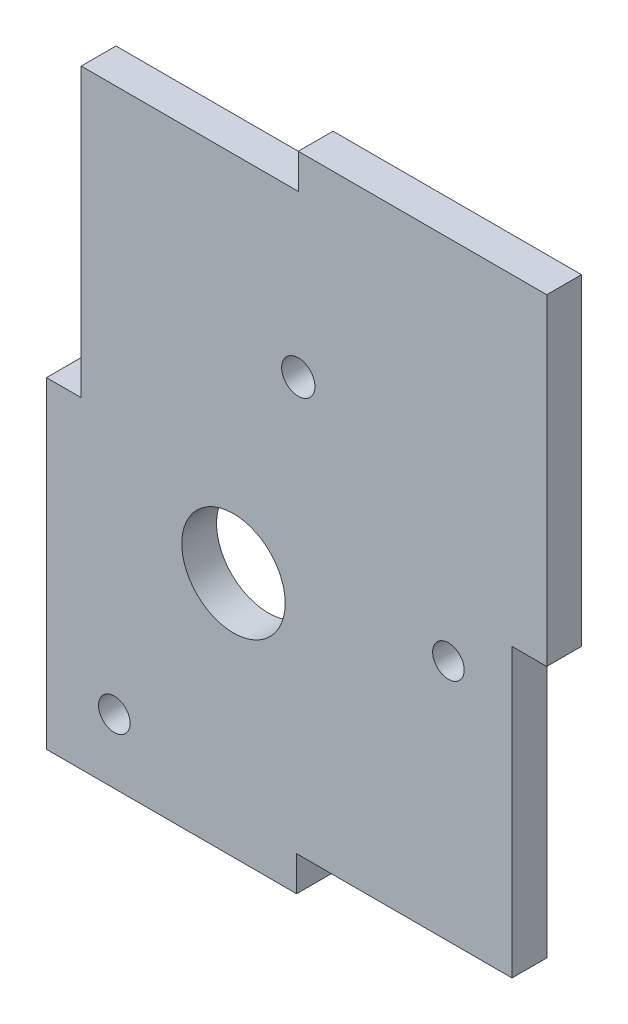
ISO-10303-21;
HEADER;
FILE_DESCRIPTION(('STEP AP214'),'2;1');
FILE_NAME('part.step','',(''),(''),'','','');
FILE_SCHEMA(('AUTOMOTIVE_DESIGN { 1 0 10303 214 1 1 1 1 }'));
ENDSEC;
DATA;
#1=APPLICATION_CONTEXT('core data for automotive mechanical design processes');
#2=APPLICATION_PROTOCOL_DEFINITION('international standard','automotive_design',2000,#1);
#3=PRODUCT_CONTEXT('',#1,'mechanical');
#4=PRODUCT('Part','Part','',(#3));
#5=PRODUCT_RELATED_PRODUCT_CATEGORY('part','',(#4));
#6=PRODUCT_DEFINITION_FORMATION('','',#4);
#7=PRODUCT_DEFINITION_CONTEXT('part definition',#1,'design');
#8=PRODUCT_DEFINITION('design','',#6,#7);
#9=PRODUCT_DEFINITION_SHAPE('','',#8);
#10=(LENGTH_UNIT() NAMED_UNIT(*) SI_UNIT(.MILLI.,.METRE.));
#11=(NAMED_UNIT(*) PLANE_ANGLE_UNIT() SI_UNIT($,.RADIAN.));
#12=(NAMED_UNIT(*) SI_UNIT($,.STERADIAN.) SOLID_ANGLE_UNIT());
#13=UNCERTAINTY_MEASURE_WITH_UNIT(LENGTH_MEASURE(1.E-05),#10,'distance_accuracy_value','');
#14=(GEOMETRIC_REPRESENTATION_CONTEXT(3) GLOBAL_UNCERTAINTY_ASSIGNED_CONTEXT((#13)) GLOBAL_UNIT_ASSIGNED_CONTEXT((#10,
#11,#12)) REPRESENTATION_CONTEXT('',''));
#15=CARTESIAN_POINT('',(0.,0.,0.));
#16=DIRECTION('',(0.,0.,1.));
#17=DIRECTION('',(1.,0.,0.));
#18=AXIS2_PLACEMENT_3D('',#15,#16,#17);
#19=CARTESIAN_POINT('',(19.05,0.,3.0734));
#20=DIRECTION('',(-1.,0.,0.));
#21=DIRECTION('',(0.,-1.,0.));
#22=AXIS2_PLACEMENT_3D('',#19,#20,#21);
#23=PLANE('',#22);
#24=DIRECTION('',(0.,1.,0.));
#25=VECTOR('',#24,1.);
#26=CARTESIAN_POINT('',(19.05,0.,0.));
#27=LINE('',#26,#25);
#28=CARTESIAN_POINT('',(19.05,-3.0734,0.));
#29=VERTEX_POINT('',#28);
#30=CARTESIAN_POINT('',(19.05,0.,0.));
#31=VERTEX_POINT('',#30);
#32=EDGE_CURVE('E167',#29,#31,#27,.T.);
#33=ORIENTED_EDGE('',*,*,#32,.T.);
#34=DIRECTION('',(0.,0.,-1.));
#35=VECTOR('',#34,1.);
#36=CARTESIAN_POINT('',(19.05,0.,3.0734));
#37=LINE('',#36,#35);
#38=CARTESIAN_POINT('',(19.05,0.,3.0734));
#39=VERTEX_POINT('',#38);
#40=EDGE_CURVE('E11',#39,#31,#37,.T.);
#41=ORIENTED_EDGE('',*,*,#40,.F.);
#42=DIRECTION('',(0.,1.,0.));
#43=VECTOR('',#42,1.);
#44=CARTESIAN_POINT('',(19.05,0.,3.0734));
#45=LINE('',#44,#43);
#46=CARTESIAN_POINT('',(19.05,-3.0734,3.0734));
#47=VERTEX_POINT('',#46);
#48=EDGE_CURVE('E208',#47,#39,#45,.T.);
#49=ORIENTED_EDGE('',*,*,#48,.F.);
#50=DIRECTION('',(0.,0.,-1.));
#51=VECTOR('',#50,1.);
#52=CARTESIAN_POINT('',(19.05,-3.0734,3.0734));
#53=LINE('',#52,#51);
#54=EDGE_CURVE('E166',#47,#29,#53,.T.);
#55=ORIENTED_EDGE('',*,*,#54,.T.);
#56=EDGE_LOOP('',(#33,#41,#49,#55));
#57=FACE_BOUND('',#56,.T.);
#58=ADVANCED_FACE('F34',(#57),#23,.F.);
#59=CARTESIAN_POINT('',(0.,0.,3.0734));
#60=DIRECTION('',(0.,1.,0.));
#61=DIRECTION('',(0.,0.,1.));
#62=AXIS2_PLACEMENT_3D('',#59,#60,#61);
#63=PLANE('',#62);
#64=DIRECTION('',(1.,0.,0.));
#65=VECTOR('',#64,1.);
#66=CARTESIAN_POINT('',(0.,0.,0.));
#67=LINE('',#66,#65);
#68=CARTESIAN_POINT('',(38.1,0.,0.));
#69=VERTEX_POINT('',#68);
#70=EDGE_CURVE('E170',#31,#69,#67,.T.);
#71=ORIENTED_EDGE('',*,*,#70,.T.);
#72=DIRECTION('',(0.,0.,-1.));
#73=VECTOR('',#72,1.);
#74=CARTESIAN_POINT('',(38.1,0.,3.0734));
#75=LINE('',#74,#73);
#76=CARTESIAN_POINT('',(38.1,0.,3.0734));
#77=VERTEX_POINT('',#76);
#78=EDGE_CURVE('E42',#77,#69,#75,.T.);
#79=ORIENTED_EDGE('',*,*,#78,.F.);
#80=DIRECTION('',(1.,0.,0.));
#81=VECTOR('',#80,1.);
#82=CARTESIAN_POINT('',(0.,0.,3.0734));
#83=LINE('',#82,#81);
#84=EDGE_CURVE('E105',#39,#77,#83,.T.);
#85=ORIENTED_EDGE('',*,*,#84,.F.);
#86=ORIENTED_EDGE('',*,*,#40,.T.);
#87=EDGE_LOOP('',(#71,#79,#85,#86));
#88=FACE_BOUND('',#87,.T.);
#89=ADVANCED_FACE('F280',(#88),#63,.F.);
#90=CARTESIAN_POINT('',(38.1,0.,3.0734));
#91=DIRECTION('',(-1.,0.,0.));
#92=DIRECTION('',(0.,0.,1.));
#93=AXIS2_PLACEMENT_3D('',#90,#91,#92);
#94=PLANE('',#93);
#95=DIRECTION('',(0.,1.,0.));
#96=VECTOR('',#95,1.);
#97=CARTESIAN_POINT('',(38.1,0.,0.));
#98=LINE('',#97,#96);
#99=CARTESIAN_POINT('',(38.1,25.4,0.));
#100=VERTEX_POINT('',#99);
#101=EDGE_CURVE('E172',#69,#100,#98,.T.);
#102=ORIENTED_EDGE('',*,*,#101,.T.);
#103=DIRECTION('',(0.,0.,-1.));
#104=VECTOR('',#103,1.);
#105=CARTESIAN_POINT('',(38.1,25.4,3.0734));
#106=LINE('',#105,#104);
#107=CARTESIAN_POINT('',(38.1,25.4,3.0734));
#108=VERTEX_POINT('',#107);
#109=EDGE_CURVE('E222',#108,#100,#106,.T.);
#110=ORIENTED_EDGE('',*,*,#109,.F.);
#111=DIRECTION('',(0.,1.,0.));
#112=VECTOR('',#111,1.);
#113=CARTESIAN_POINT('',(38.1,0.,3.0734));
#114=LINE('',#113,#112);
#115=EDGE_CURVE('E229',#77,#108,#114,.T.);
#116=ORIENTED_EDGE('',*,*,#115,.F.);
#117=ORIENTED_EDGE('',*,*,#78,.T.);
#118=EDGE_LOOP('',(#102,#110,#116,#117));
#119=FACE_BOUND('',#118,.T.);
#120=ADVANCED_FACE('F227',(#119),#94,.F.);
#121=CARTESIAN_POINT('',(0.,25.4,3.0734));
#122=DIRECTION('',(0.,-1.,0.));
#123=DIRECTION('',(0.,0.,-1.));
#124=AXIS2_PLACEMENT_3D('',#121,#122,#123);
#125=PLANE('',#124);
#126=DIRECTION('',(-1.,0.,0.));
#127=VECTOR('',#126,1.);
#128=CARTESIAN_POINT('',(0.,25.4,0.));
#129=LINE('',#128,#127);
#130=CARTESIAN_POINT('',(41.1734,25.4,0.));
#131=VERTEX_POINT('',#130);
#132=EDGE_CURVE('E175',#131,#100,#129,.T.);
#133=ORIENTED_EDGE('',*,*,#132,.F.);
#134=DIRECTION('',(0.,0.,-1.));
#135=VECTOR('',#134,1.);
#136=CARTESIAN_POINT('',(41.1734,25.4,3.0734));
#137=LINE('',#136,#135);
#138=CARTESIAN_POINT('',(41.1734,25.4,3.0734));
#139=VERTEX_POINT('',#138);
#140=EDGE_CURVE('E220',#139,#131,#137,.T.);
#141=ORIENTED_EDGE('',*,*,#140,.F.);
#142=DIRECTION('',(-1.,0.,0.));
#143=VECTOR('',#142,1.);
#144=CARTESIAN_POINT('',(0.,25.4,3.0734));
#145=LINE('',#144,#143);
#146=EDGE_CURVE('E240',#139,#108,#145,.T.);
#147=ORIENTED_EDGE('',*,*,#146,.T.);
#148=ORIENTED_EDGE('',*,*,#109,.T.);
#149=EDGE_LOOP('',(#133,#141,#147,#148));
#150=FACE_BOUND('',#149,.T.);
#151=ADVANCED_FACE('F237',(#150),#125,.T.);
#152=CARTESIAN_POINT('',(41.1734,0.,3.0734));
#153=DIRECTION('',(1.,0.,0.));
#154=DIRECTION('',(0.,1.,0.));
#155=AXIS2_PLACEMENT_3D('',#152,#153,#154);
#156=PLANE('',#155);
#157=DIRECTION('',(0.,-1.,0.));
#158=VECTOR('',#157,1.);
#159=CARTESIAN_POINT('',(41.1734,0.,0.));
#160=LINE('',#159,#158);
#161=CARTESIAN_POINT('',(41.1734,53.8734,0.));
#162=VERTEX_POINT('',#161);
#163=EDGE_CURVE('E178',#162,#131,#160,.T.);
#164=ORIENTED_EDGE('',*,*,#163,.F.);
#165=DIRECTION('',(0.,0.,-1.));
#166=VECTOR('',#165,1.);
#167=CARTESIAN_POINT('',(41.1734,53.8734,3.0734));
#168=LINE('',#167,#166);
#169=CARTESIAN_POINT('',(41.1734,53.8734,3.0734));
#170=VERTEX_POINT('',#169);
#171=EDGE_CURVE('E218',#170,#162,#168,.T.);
#172=ORIENTED_EDGE('',*,*,#171,.F.);
#173=DIRECTION('',(0.,-1.,0.));
#174=VECTOR('',#173,1.);
#175=CARTESIAN_POINT('',(41.1734,0.,3.0734));
#176=LINE('',#175,#174);
#177=EDGE_CURVE('E243',#170,#139,#176,.T.);
#178=ORIENTED_EDGE('',*,*,#177,.T.);
#179=ORIENTED_EDGE('',*,*,#140,.T.);
#180=EDGE_LOOP('',(#164,#172,#178,#179));
#181=FACE_BOUND('',#180,.T.);
#182=ADVANCED_FACE('F291',(#181),#156,.T.);
#183=CARTESIAN_POINT('',(0.,53.8734,3.0734));
#184=DIRECTION('',(0.,1.,0.));
#185=DIRECTION('',(0.,0.,1.));
#186=AXIS2_PLACEMENT_3D('',#183,#184,#185);
#187=PLANE('',#186);
#188=DIRECTION('',(1.,0.,0.));
#189=VECTOR('',#188,1.);
#190=CARTESIAN_POINT('',(0.,53.8734,0.));
#191=LINE('',#190,#189);
#192=CARTESIAN_POINT('',(19.1967167483988,53.8734,0.));
#193=VERTEX_POINT('',#192);
#194=EDGE_CURVE('E181',#193,#162,#191,.T.);
#195=ORIENTED_EDGE('',*,*,#194,.F.);
#196=DIRECTION('',(0.,0.,-1.));
#197=VECTOR('',#196,1.);
#198=CARTESIAN_POINT('',(19.1967167483988,53.8734,3.0734));
#199=LINE('',#198,#197);
#200=CARTESIAN_POINT('',(19.1967167483988,53.8734,3.0734));
#201=VERTEX_POINT('',#200);
#202=EDGE_CURVE('E216',#201,#193,#199,.T.);
#203=ORIENTED_EDGE('',*,*,#202,.F.);
#204=DIRECTION('',(1.,0.,0.));
#205=VECTOR('',#204,1.);
#206=CARTESIAN_POINT('',(0.,53.8734,3.0734));
#207=LINE('',#206,#205);
#208=EDGE_CURVE('E245',#201,#170,#207,.T.);
#209=ORIENTED_EDGE('',*,*,#208,.T.);
#210=ORIENTED_EDGE('',*,*,#171,.T.);
#211=EDGE_LOOP('',(#195,#203,#209,#210));
#212=FACE_BOUND('',#211,.T.);
#213=ADVANCED_FACE('F294',(#212),#187,.T.);
#214=CARTESIAN_POINT('',(19.1967167483988,0.,3.0734));
#215=DIRECTION('',(-1.,0.,0.));
#216=DIRECTION('',(0.,0.,1.));
#217=AXIS2_PLACEMENT_3D('',#214,#215,#216);
#218=PLANE('',#217);
#219=DIRECTION('',(0.,1.,0.));
#220=VECTOR('',#219,1.);
#221=CARTESIAN_POINT('',(19.1967167483988,0.,0.));
#222=LINE('',#221,#220);
#223=CARTESIAN_POINT('',(19.1967167483988,50.8,0.));
#224=VERTEX_POINT('',#223);
#225=EDGE_CURVE('E184',#224,#193,#222,.T.);
#226=ORIENTED_EDGE('',*,*,#225,.F.);
#227=DIRECTION('',(0.,0.,-1.));
#228=VECTOR('',#227,1.);
#229=CARTESIAN_POINT('',(19.1967167483988,50.8,3.0734));
#230=LINE('',#229,#228);
#231=CARTESIAN_POINT('',(19.1967167483988,50.8,3.0734));
#232=VERTEX_POINT('',#231);
#233=EDGE_CURVE('E214',#232,#224,#230,.T.);
#234=ORIENTED_EDGE('',*,*,#233,.F.);
#235=DIRECTION('',(0.,1.,0.));
#236=VECTOR('',#235,1.);
#237=CARTESIAN_POINT('',(19.1967167483988,0.,3.0734));
#238=LINE('',#237,#236);
#239=EDGE_CURVE('E252',#232,#201,#238,.T.);
#240=ORIENTED_EDGE('',*,*,#239,.T.);
#241=ORIENTED_EDGE('',*,*,#202,.T.);
#242=EDGE_LOOP('',(#226,#234,#240,#241));
#243=FACE_BOUND('',#242,.T.);
#244=ADVANCED_FACE('F298',(#243),#218,.T.);
#245=CARTESIAN_POINT('',(0.,50.8,3.0734));
#246=DIRECTION('',(0.,1.,0.));
#247=DIRECTION('',(0.,0.,1.));
#248=AXIS2_PLACEMENT_3D('',#245,#246,#247);
#249=PLANE('',#248);
#250=DIRECTION('',(1.,0.,0.));
#251=VECTOR('',#250,1.);
#252=CARTESIAN_POINT('',(0.,50.8,0.));
#253=LINE('',#252,#251);
#254=CARTESIAN_POINT('',(0.,50.8,0.));
#255=VERTEX_POINT('',#254);
#256=EDGE_CURVE('E187',#255,#224,#253,.T.);
#257=ORIENTED_EDGE('',*,*,#256,.F.);
#258=DIRECTION('',(0.,0.,-1.));
#259=VECTOR('',#258,1.);
#260=CARTESIAN_POINT('',(0.,50.8,3.0734));
#261=LINE('',#260,#259);
#262=CARTESIAN_POINT('',(0.,50.8,3.0734));
#263=VERTEX_POINT('',#262);
#264=EDGE_CURVE('E212',#263,#255,#261,.T.);
#265=ORIENTED_EDGE('',*,*,#264,.F.);
#266=DIRECTION('',(1.,0.,0.));
#267=VECTOR('',#266,1.);
#268=CARTESIAN_POINT('',(0.,50.8,3.0734));
#269=LINE('',#268,#267);
#270=EDGE_CURVE('E255',#263,#232,#269,.T.);
#271=ORIENTED_EDGE('',*,*,#270,.T.);
#272=ORIENTED_EDGE('',*,*,#233,.T.);
#273=EDGE_LOOP('',(#257,#265,#271,#272));
#274=FACE_BOUND('',#273,.T.);
#275=ADVANCED_FACE('F302',(#274),#249,.T.);
#276=CARTESIAN_POINT('',(0.,0.,3.0734));
#277=DIRECTION('',(-1.,0.,0.));
#278=DIRECTION('',(0.,0.,1.));
#279=AXIS2_PLACEMENT_3D('',#276,#277,#278);
#280=PLANE('',#279);
#281=DIRECTION('',(0.,1.,0.));
#282=VECTOR('',#281,1.);
#283=CARTESIAN_POINT('',(0.,0.,0.));
#284=LINE('',#283,#282);
#285=CARTESIAN_POINT('',(0.,25.4,0.));
#286=VERTEX_POINT('',#285);
#287=EDGE_CURVE('E190',#286,#255,#284,.T.);
#288=ORIENTED_EDGE('',*,*,#287,.F.);
#289=DIRECTION('',(0.,0.,-1.));
#290=VECTOR('',#289,1.);
#291=CARTESIAN_POINT('',(0.,25.4,3.0734));
#292=LINE('',#291,#290);
#293=CARTESIAN_POINT('',(0.,25.4,3.0734));
#294=VERTEX_POINT('',#293);
#295=EDGE_CURVE('E146',#294,#286,#292,.T.);
#296=ORIENTED_EDGE('',*,*,#295,.F.);
#297=DIRECTION('',(0.,1.,0.));
#298=VECTOR('',#297,1.);
#299=CARTESIAN_POINT('',(0.,0.,3.0734));
#300=LINE('',#299,#298);
#301=EDGE_CURVE('E139',#294,#263,#300,.T.);
#302=ORIENTED_EDGE('',*,*,#301,.T.);
#303=ORIENTED_EDGE('',*,*,#264,.T.);
#304=EDGE_LOOP('',(#288,#296,#302,#303));
#305=FACE_BOUND('',#304,.T.);
#306=ADVANCED_FACE('F259',(#305),#280,.T.);
#307=CARTESIAN_POINT('',(0.,25.4,3.0734));
#308=DIRECTION('',(0.,-1.,0.));
#309=DIRECTION('',(0.,0.,-1.));
#310=AXIS2_PLACEMENT_3D('',#307,#308,#309);
#311=PLANE('',#310);
#312=DIRECTION('',(-1.,0.,0.));
#313=VECTOR('',#312,1.);
#314=CARTESIAN_POINT('',(0.,25.4,0.));
#315=LINE('',#314,#313);
#316=CARTESIAN_POINT('',(-3.0734,25.4,0.));
#317=VERTEX_POINT('',#316);
#318=EDGE_CURVE('E145',#286,#317,#315,.T.);
#319=ORIENTED_EDGE('',*,*,#318,.T.);
#320=DIRECTION('',(0.,0.,-1.));
#321=VECTOR('',#320,1.);
#322=CARTESIAN_POINT('',(-3.0734,25.4,3.0734));
#323=LINE('',#322,#321);
#324=CARTESIAN_POINT('',(-3.0734,25.4,3.0734));
#325=VERTEX_POINT('',#324);
#326=EDGE_CURVE('E142',#325,#317,#323,.T.);
#327=ORIENTED_EDGE('',*,*,#326,.F.);
#328=DIRECTION('',(-1.,0.,0.));
#329=VECTOR('',#328,1.);
#330=CARTESIAN_POINT('',(0.,25.4,3.0734));
#331=LINE('',#330,#329);
#332=EDGE_CURVE('E131',#294,#325,#331,.T.);
#333=ORIENTED_EDGE('',*,*,#332,.F.);
#334=ORIENTED_EDGE('',*,*,#295,.T.);
#335=EDGE_LOOP('',(#319,#327,#333,#334));
#336=FACE_BOUND('',#335,.T.);
#337=ADVANCED_FACE('F143',(#336),#311,.F.);
#338=CARTESIAN_POINT('',(-3.0734,0.,3.0734));
#339=DIRECTION('',(1.,0.,0.));
#340=DIRECTION('',(0.,1.,0.));
#341=AXIS2_PLACEMENT_3D('',#338,#339,#340);
#342=PLANE('',#341);
#343=DIRECTION('',(0.,-1.,0.));
#344=VECTOR('',#343,1.);
#345=CARTESIAN_POINT('',(-3.0734,0.,0.));
#346=LINE('',#345,#344);
#347=CARTESIAN_POINT('',(-3.0734,-3.0734,0.));
#348=VERTEX_POINT('',#347);
#349=EDGE_CURVE('E91',#317,#348,#346,.T.);
#350=ORIENTED_EDGE('',*,*,#349,.T.);
#351=DIRECTION('',(0.,0.,-1.));
#352=VECTOR('',#351,1.);
#353=CARTESIAN_POINT('',(-3.0734,-3.0734,3.0734));
#354=LINE('',#353,#352);
#355=CARTESIAN_POINT('',(-3.0734,-3.0734,3.0734));
#356=VERTEX_POINT('',#355);
#357=EDGE_CURVE('E147',#356,#348,#354,.T.);
#358=ORIENTED_EDGE('',*,*,#357,.F.);
#359=DIRECTION('',(0.,-1.,0.));
#360=VECTOR('',#359,1.);
#361=CARTESIAN_POINT('',(-3.0734,0.,3.0734));
#362=LINE('',#361,#360);
#363=EDGE_CURVE('E136',#325,#356,#362,.T.);
#364=ORIENTED_EDGE('',*,*,#363,.F.);
#365=ORIENTED_EDGE('',*,*,#326,.T.);
#366=EDGE_LOOP('',(#350,#358,#364,#365));
#367=FACE_BOUND('',#366,.T.);
#368=ADVANCED_FACE('F149',(#367),#342,.F.);
#369=CARTESIAN_POINT('',(32.4752684881933,21.4662483771433,3.0734));
#370=DIRECTION('',(0.,0.,-1.));
#371=DIRECTION('',(-1.,0.,0.));
#372=AXIS2_PLACEMENT_3D('',#369,#370,#371);
#373=CYLINDRICAL_SURFACE('',#372,1.39700000000001);
#374=CARTESIAN_POINT('',(32.4752684881933,21.4662483771433,3.0734));
#375=DIRECTION('',(0.,0.,1.));
#376=DIRECTION('',(1.,0.,0.));
#377=AXIS2_PLACEMENT_3D('',#374,#375,#376);
#378=CIRCLE('',#377,1.39700000000001);
#379=CARTESIAN_POINT('',(33.8722684881933,21.4662483771433,3.0734));
#380=VERTEX_POINT('',#379);
#381=EDGE_CURVE('E160',#380,#380,#378,.T.);
#382=ORIENTED_EDGE('',*,*,#381,.T.);
#383=EDGE_LOOP('',(#382));
#384=FACE_BOUND('',#383,.T.);
#385=CARTESIAN_POINT('',(32.4752684881933,21.4662483771433,0.));
#386=DIRECTION('',(0.,0.,1.));
#387=DIRECTION('',(1.,0.,0.));
#388=AXIS2_PLACEMENT_3D('',#385,#386,#387);
#389=CIRCLE('',#388,1.39700000000001);
#390=CARTESIAN_POINT('',(33.8722684881933,21.4662483771433,0.));
#391=VERTEX_POINT('',#390);
#392=EDGE_CURVE('E202',#391,#391,#389,.T.);
#393=ORIENTED_EDGE('',*,*,#392,.F.);
#394=EDGE_LOOP('',(#393));
#395=FACE_BOUND('',#394,.T.);
#396=ADVANCED_FACE('F311',(#384,#395),#373,.F.);
#397=CARTESIAN_POINT('',(13.4651505673275,18.6777059918142,3.0734));
#398=DIRECTION('',(0.,0.,-1.));
#399=DIRECTION('',(-1.,0.,0.));
#400=AXIS2_PLACEMENT_3D('',#397,#398,#399);
#401=CYLINDRICAL_SURFACE('',#400,4.572);
#402=CARTESIAN_POINT('',(13.4651505673275,18.6777059918142,3.0734));
#403=DIRECTION('',(0.,0.,1.));
#404=DIRECTION('',(1.,0.,0.));
#405=AXIS2_PLACEMENT_3D('',#402,#403,#404);
#406=CIRCLE('',#405,4.572);
#407=CARTESIAN_POINT('',(18.0371505673275,18.6777059918142,3.0734));
#408=VERTEX_POINT('',#407);
#409=EDGE_CURVE('E157',#408,#408,#406,.T.);
#410=ORIENTED_EDGE('',*,*,#409,.T.);
#411=EDGE_LOOP('',(#410));
#412=FACE_BOUND('',#411,.T.);
#413=CARTESIAN_POINT('',(13.4651505673275,18.6777059918142,0.));
#414=DIRECTION('',(0.,0.,1.));
#415=DIRECTION('',(1.,0.,0.));
#416=AXIS2_PLACEMENT_3D('',#413,#414,#415);
#417=CIRCLE('',#416,4.572);
#418=CARTESIAN_POINT('',(18.0371505673275,18.6777059918142,0.));
#419=VERTEX_POINT('',#418);
#420=EDGE_CURVE('E199',#419,#419,#417,.T.);
#421=ORIENTED_EDGE('',*,*,#420,.F.);
#422=EDGE_LOOP('',(#421));
#423=FACE_BOUND('',#422,.T.);
#424=ADVANCED_FACE('F275',(#412,#423),#401,.F.);
#425=CARTESIAN_POINT('',(19.1967167483988,36.57850946853,3.0734));
#426=DIRECTION('',(0.,0.,-1.));
#427=DIRECTION('',(-1.,0.,0.));
#428=AXIS2_PLACEMENT_3D('',#425,#426,#427);
#429=CYLINDRICAL_SURFACE('',#428,1.47319999999999);
#430=CARTESIAN_POINT('',(19.1967167483988,36.57850946853,3.0734));
#431=DIRECTION('',(0.,0.,1.));
#432=DIRECTION('',(1.,0.,0.));
#433=AXIS2_PLACEMENT_3D('',#430,#431,#432);
#434=CIRCLE('',#433,1.47319999999999);
#435=CARTESIAN_POINT('',(20.6699167483987,36.57850946853,3.0734));
#436=VERTEX_POINT('',#435);
#437=EDGE_CURVE('E151',#436,#436,#434,.T.);
#438=ORIENTED_EDGE('',*,*,#437,.T.);
#439=EDGE_LOOP('',(#438));
#440=FACE_BOUND('',#439,.T.);
#441=CARTESIAN_POINT('',(19.1967167483988,36.57850946853,0.));
#442=DIRECTION('',(0.,0.,1.));
#443=DIRECTION('',(1.,0.,0.));
#444=AXIS2_PLACEMENT_3D('',#441,#442,#443);
#445=CIRCLE('',#444,1.47319999999999);
#446=CARTESIAN_POINT('',(20.6699167483987,36.57850946853,0.));
#447=VERTEX_POINT('',#446);
#448=EDGE_CURVE('E196',#447,#447,#445,.T.);
#449=ORIENTED_EDGE('',*,*,#448,.F.);
#450=EDGE_LOOP('',(#449));
#451=FACE_BOUND('',#450,.T.);
#452=ADVANCED_FACE('F267',(#440,#451),#429,.F.);
#453=CARTESIAN_POINT('',(0.,-3.0734,3.0734));
#454=DIRECTION('',(0.,1.,0.));
#455=DIRECTION('',(0.,0.,1.));
#456=AXIS2_PLACEMENT_3D('',#453,#454,#455);
#457=PLANE('',#456);
#458=DIRECTION('',(1.,0.,0.));
#459=VECTOR('',#458,1.);
#460=CARTESIAN_POINT('',(0.,-3.0734,0.));
#461=LINE('',#460,#459);
#462=EDGE_CURVE('E97',#348,#29,#461,.T.);
#463=ORIENTED_EDGE('',*,*,#462,.T.);
#464=ORIENTED_EDGE('',*,*,#54,.F.);
#465=DIRECTION('',(1.,0.,0.));
#466=VECTOR('',#465,1.);
#467=CARTESIAN_POINT('',(0.,-3.0734,3.0734));
#468=LINE('',#467,#466);
#469=EDGE_CURVE('E50',#356,#47,#468,.T.);
#470=ORIENTED_EDGE('',*,*,#469,.F.);
#471=ORIENTED_EDGE('',*,*,#357,.T.);
#472=EDGE_LOOP('',(#463,#464,#470,#471));
#473=FACE_BOUND('',#472,.T.);
#474=ADVANCED_FACE('F264',(#473),#457,.F.);
#475=CARTESIAN_POINT('',(2.92529321415511,2.61308775872891,3.0734));
#476=DIRECTION('',(0.,0.,-1.));
#477=DIRECTION('',(-1.,0.,0.));
#478=AXIS2_PLACEMENT_3D('',#475,#476,#477);
#479=CYLINDRICAL_SURFACE('',#478,1.39700000000001);
#480=CARTESIAN_POINT('',(2.92529321415511,2.61308775872891,3.0734));
#481=DIRECTION('',(0.,0.,1.));
#482=DIRECTION('',(1.,0.,0.));
#483=AXIS2_PLACEMENT_3D('',#480,#481,#482);
#484=CIRCLE('',#483,1.39700000000001);
#485=CARTESIAN_POINT('',(4.32229321415512,2.61308775872891,3.0734));
#486=VERTEX_POINT('',#485);
#487=EDGE_CURVE('E163',#486,#486,#484,.T.);
#488=ORIENTED_EDGE('',*,*,#487,.T.);
#489=EDGE_LOOP('',(#488));
#490=FACE_BOUND('',#489,.T.);
#491=CARTESIAN_POINT('',(2.92529321415511,2.61308775872891,0.));
#492=DIRECTION('',(0.,0.,1.));
#493=DIRECTION('',(1.,0.,0.));
#494=AXIS2_PLACEMENT_3D('',#491,#492,#493);
#495=CIRCLE('',#494,1.39700000000001);
#496=CARTESIAN_POINT('',(4.32229321415512,2.61308775872891,0.));
#497=VERTEX_POINT('',#496);
#498=EDGE_CURVE('E205',#497,#497,#495,.T.);
#499=ORIENTED_EDGE('',*,*,#498,.F.);
#500=EDGE_LOOP('',(#499));
#501=FACE_BOUND('',#500,.T.);
#502=ADVANCED_FACE('F266',(#490,#501),#479,.F.);
#503=CARTESIAN_POINT('',(0.,0.,3.0734));
#504=DIRECTION('',(0.,0.,1.));
#505=DIRECTION('',(1.,0.,0.));
#506=AXIS2_PLACEMENT_3D('',#503,#504,#505);
#507=PLANE('',#506);
#508=ORIENTED_EDGE('',*,*,#48,.T.);
#509=ORIENTED_EDGE('',*,*,#84,.T.);
#510=ORIENTED_EDGE('',*,*,#115,.T.);
#511=ORIENTED_EDGE('',*,*,#146,.F.);
#512=ORIENTED_EDGE('',*,*,#177,.F.);
#513=ORIENTED_EDGE('',*,*,#208,.F.);
#514=ORIENTED_EDGE('',*,*,#239,.F.);
#515=ORIENTED_EDGE('',*,*,#270,.F.);
#516=ORIENTED_EDGE('',*,*,#301,.F.);
#517=ORIENTED_EDGE('',*,*,#332,.T.);
#518=ORIENTED_EDGE('',*,*,#363,.T.);
#519=ORIENTED_EDGE('',*,*,#469,.T.);
#520=EDGE_LOOP('',(#508,#509,#510,#511,#512,#513,#514,#515,#516,#517,#518,#519));
#521=FACE_BOUND('',#520,.T.);
#522=ORIENTED_EDGE('',*,*,#437,.F.);
#523=EDGE_LOOP('',(#522));
#524=FACE_BOUND('',#523,.T.);
#525=ORIENTED_EDGE('',*,*,#409,.F.);
#526=EDGE_LOOP('',(#525));
#527=FACE_BOUND('',#526,.T.);
#528=ORIENTED_EDGE('',*,*,#381,.F.);
#529=EDGE_LOOP('',(#528));
#530=FACE_BOUND('',#529,.T.);
#531=ORIENTED_EDGE('',*,*,#487,.F.);
#532=EDGE_LOOP('',(#531));
#533=FACE_BOUND('',#532,.T.);
#534=ADVANCED_FACE('F133',(#521,#524,#527,#530,#533),#507,.T.);
#535=CARTESIAN_POINT('',(0.,0.,0.));
#536=DIRECTION('',(0.,0.,1.));
#537=DIRECTION('',(1.,0.,0.));
#538=AXIS2_PLACEMENT_3D('',#535,#536,#537);
#539=PLANE('',#538);
#540=ORIENTED_EDGE('',*,*,#32,.F.);
#541=ORIENTED_EDGE('',*,*,#462,.F.);
#542=ORIENTED_EDGE('',*,*,#349,.F.);
#543=ORIENTED_EDGE('',*,*,#318,.F.);
#544=ORIENTED_EDGE('',*,*,#287,.T.);
#545=ORIENTED_EDGE('',*,*,#256,.T.);
#546=ORIENTED_EDGE('',*,*,#225,.T.);
#547=ORIENTED_EDGE('',*,*,#194,.T.);
#548=ORIENTED_EDGE('',*,*,#163,.T.);
#549=ORIENTED_EDGE('',*,*,#132,.T.);
#550=ORIENTED_EDGE('',*,*,#101,.F.);
#551=ORIENTED_EDGE('',*,*,#70,.F.);
#552=EDGE_LOOP('',(#540,#541,#542,#543,#544,#545,#546,#547,#548,#549,#550,#551));
#553=FACE_BOUND('',#552,.T.);
#554=ORIENTED_EDGE('',*,*,#448,.T.);
#555=EDGE_LOOP('',(#554));
#556=FACE_BOUND('',#555,.T.);
#557=ORIENTED_EDGE('',*,*,#420,.T.);
#558=EDGE_LOOP('',(#557));
#559=FACE_BOUND('',#558,.T.);
#560=ORIENTED_EDGE('',*,*,#392,.T.);
#561=EDGE_LOOP('',(#560));
#562=FACE_BOUND('',#561,.T.);
#563=ORIENTED_EDGE('',*,*,#498,.T.);
#564=EDGE_LOOP('',(#563));
#565=FACE_BOUND('',#564,.T.);
#566=ADVANCED_FACE('F232',(#553,#556,#559,#562,#565),#539,.F.);
#567=CLOSED_SHELL('',(#58,#89,#120,#151,#182,#213,#244,#275,#306,#337,#368,#396,#424,#452,#474,
#502,#534,#566));
#568=MANIFOLD_SOLID_BREP('B2',#567);
#569=ADVANCED_BREP_SHAPE_REPRESENTATION('',(#18,#568),#14);
#570=SHAPE_DEFINITION_REPRESENTATION(#9,#569);
ENDSEC;
END-ISO-10303-21;
